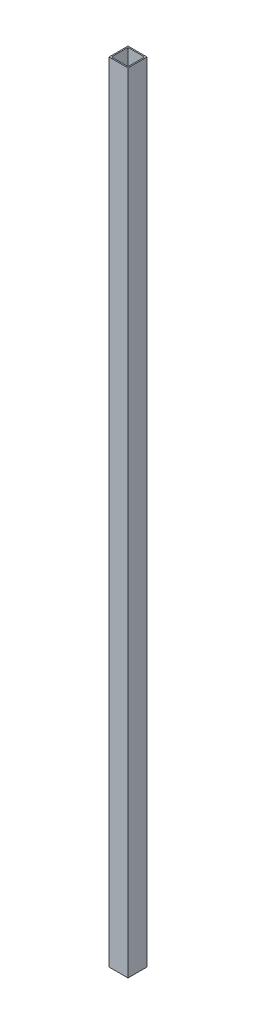
ISO-10303-21;
HEADER;
FILE_DESCRIPTION(('STEP AP214'),'2;1');
FILE_NAME('part.step','',(''),(''),'','','');
FILE_SCHEMA(('AUTOMOTIVE_DESIGN { 1 0 10303 214 1 1 1 1 }'));
ENDSEC;
DATA;
#1=APPLICATION_CONTEXT('core data for automotive mechanical design processes');
#2=APPLICATION_PROTOCOL_DEFINITION('international standard','automotive_design',2000,#1);
#3=PRODUCT_CONTEXT('',#1,'mechanical');
#4=PRODUCT('Part','Part','',(#3));
#5=PRODUCT_RELATED_PRODUCT_CATEGORY('part','',(#4));
#6=PRODUCT_DEFINITION_FORMATION('','',#4);
#7=PRODUCT_DEFINITION_CONTEXT('part definition',#1,'design');
#8=PRODUCT_DEFINITION('design','',#6,#7);
#9=PRODUCT_DEFINITION_SHAPE('','',#8);
#10=(LENGTH_UNIT() NAMED_UNIT(*) SI_UNIT(.MILLI.,.METRE.));
#11=(NAMED_UNIT(*) PLANE_ANGLE_UNIT() SI_UNIT($,.RADIAN.));
#12=(NAMED_UNIT(*) SI_UNIT($,.STERADIAN.) SOLID_ANGLE_UNIT());
#13=UNCERTAINTY_MEASURE_WITH_UNIT(LENGTH_MEASURE(1.E-05),#10,'distance_accuracy_value','');
#14=(GEOMETRIC_REPRESENTATION_CONTEXT(3) GLOBAL_UNCERTAINTY_ASSIGNED_CONTEXT((#13)) GLOBAL_UNIT_ASSIGNED_CONTEXT((#10,
#11,#12)) REPRESENTATION_CONTEXT('',''));
#15=CARTESIAN_POINT('',(0.,0.,0.));
#16=DIRECTION('',(0.,0.,1.));
#17=DIRECTION('',(1.,0.,0.));
#18=AXIS2_PLACEMENT_3D('',#15,#16,#17);
#19=CARTESIAN_POINT('',(-12.7,0.,12.7));
#20=DIRECTION('',(0.,-1.,0.));
#21=DIRECTION('',(0.,0.,-1.));
#22=AXIS2_PLACEMENT_3D('',#19,#20,#21);
#23=PLANE('',#22);
#24=DIRECTION('',(1.,0.,0.));
#25=VECTOR('',#24,1.);
#26=CARTESIAN_POINT('',(0.,0.,-11.1125));
#27=LINE('',#26,#25);
#28=CARTESIAN_POINT('',(-11.1125,0.,-11.1125));
#29=VERTEX_POINT('',#28);
#30=CARTESIAN_POINT('',(11.1125,0.,-11.1125));
#31=VERTEX_POINT('',#30);
#32=EDGE_CURVE('E108',#29,#31,#27,.T.);
#33=ORIENTED_EDGE('',*,*,#32,.F.);
#34=DIRECTION('',(0.,0.,-1.));
#35=VECTOR('',#34,1.);
#36=CARTESIAN_POINT('',(-11.1125,0.,0.));
#37=LINE('',#36,#35);
#38=CARTESIAN_POINT('',(-11.1125,0.,11.1125));
#39=VERTEX_POINT('',#38);
#40=EDGE_CURVE('E110',#39,#29,#37,.T.);
#41=ORIENTED_EDGE('',*,*,#40,.F.);
#42=DIRECTION('',(-1.,0.,0.));
#43=VECTOR('',#42,1.);
#44=CARTESIAN_POINT('',(0.,0.,11.1125));
#45=LINE('',#44,#43);
#46=CARTESIAN_POINT('',(11.1125,0.,11.1125));
#47=VERTEX_POINT('',#46);
#48=EDGE_CURVE('E114',#47,#39,#45,.T.);
#49=ORIENTED_EDGE('',*,*,#48,.F.);
#50=DIRECTION('',(0.,0.,1.));
#51=VECTOR('',#50,1.);
#52=CARTESIAN_POINT('',(11.1125,0.,0.));
#53=LINE('',#52,#51);
#54=EDGE_CURVE('E118',#31,#47,#53,.T.);
#55=ORIENTED_EDGE('',*,*,#54,.F.);
#56=EDGE_LOOP('',(#33,#41,#49,#55));
#57=FACE_BOUND('',#56,.T.);
#58=DIRECTION('',(0.,0.,-1.));
#59=VECTOR('',#58,1.);
#60=CARTESIAN_POINT('',(-12.7,0.,0.));
#61=LINE('',#60,#59);
#62=CARTESIAN_POINT('',(-12.7,0.,12.7));
#63=VERTEX_POINT('',#62);
#64=CARTESIAN_POINT('',(-12.7,0.,-12.7));
#65=VERTEX_POINT('',#64);
#66=EDGE_CURVE('E78',#63,#65,#61,.T.);
#67=ORIENTED_EDGE('',*,*,#66,.T.);
#68=DIRECTION('',(1.,0.,0.));
#69=VECTOR('',#68,1.);
#70=CARTESIAN_POINT('',(0.,0.,-12.7));
#71=LINE('',#70,#69);
#72=CARTESIAN_POINT('',(12.7,0.,-12.7));
#73=VERTEX_POINT('',#72);
#74=EDGE_CURVE('E100',#65,#73,#71,.T.);
#75=ORIENTED_EDGE('',*,*,#74,.T.);
#76=DIRECTION('',(0.,0.,1.));
#77=VECTOR('',#76,1.);
#78=CARTESIAN_POINT('',(12.7,0.,0.));
#79=LINE('',#78,#77);
#80=CARTESIAN_POINT('',(12.7,0.,12.7));
#81=VERTEX_POINT('',#80);
#82=EDGE_CURVE('E82',#73,#81,#79,.T.);
#83=ORIENTED_EDGE('',*,*,#82,.T.);
#84=DIRECTION('',(-1.,0.,0.));
#85=VECTOR('',#84,1.);
#86=CARTESIAN_POINT('',(0.,0.,12.7));
#87=LINE('',#86,#85);
#88=EDGE_CURVE('E20',#81,#63,#87,.T.);
#89=ORIENTED_EDGE('',*,*,#88,.T.);
#90=EDGE_LOOP('',(#67,#75,#83,#89));
#91=FACE_BOUND('',#90,.T.);
#92=ADVANCED_FACE('F16',(#57,#91),#23,.T.);
#93=CARTESIAN_POINT('',(12.7,0.,12.7));
#94=DIRECTION('',(0.,0.,-1.));
#95=DIRECTION('',(-1.,0.,0.));
#96=AXIS2_PLACEMENT_3D('',#93,#94,#95);
#97=PLANE('',#96);
#98=DIRECTION('',(0.,1.,0.));
#99=VECTOR('',#98,1.);
#100=CARTESIAN_POINT('',(12.7,527.05,12.7));
#101=LINE('',#100,#99);
#102=CARTESIAN_POINT('',(12.7,1054.1,12.7));
#103=VERTEX_POINT('',#102);
#104=EDGE_CURVE('E102',#81,#103,#101,.T.);
#105=ORIENTED_EDGE('',*,*,#104,.T.);
#106=DIRECTION('',(-1.,0.,0.));
#107=VECTOR('',#106,1.);
#108=CARTESIAN_POINT('',(0.,1054.1,12.7));
#109=LINE('',#108,#107);
#110=CARTESIAN_POINT('',(-12.7,1054.1,12.7));
#111=VERTEX_POINT('',#110);
#112=EDGE_CURVE('E97',#103,#111,#109,.T.);
#113=ORIENTED_EDGE('',*,*,#112,.T.);
#114=DIRECTION('',(0.,-1.,0.));
#115=VECTOR('',#114,1.);
#116=CARTESIAN_POINT('',(-12.7,527.05,12.7));
#117=LINE('',#116,#115);
#118=EDGE_CURVE('E87',#111,#63,#117,.T.);
#119=ORIENTED_EDGE('',*,*,#118,.T.);
#120=ORIENTED_EDGE('',*,*,#88,.F.);
#121=EDGE_LOOP('',(#105,#113,#119,#120));
#122=FACE_BOUND('',#121,.T.);
#123=ADVANCED_FACE('F96',(#122),#97,.F.);
#124=CARTESIAN_POINT('',(-12.7,0.,12.7));
#125=DIRECTION('',(1.,0.,0.));
#126=DIRECTION('',(0.,0.,-1.));
#127=AXIS2_PLACEMENT_3D('',#124,#125,#126);
#128=PLANE('',#127);
#129=ORIENTED_EDGE('',*,*,#118,.F.);
#130=DIRECTION('',(0.,0.,-1.));
#131=VECTOR('',#130,1.);
#132=CARTESIAN_POINT('',(-12.7,1054.1,0.));
#133=LINE('',#132,#131);
#134=CARTESIAN_POINT('',(-12.7,1054.1,-12.7));
#135=VERTEX_POINT('',#134);
#136=EDGE_CURVE('E125',#111,#135,#133,.T.);
#137=ORIENTED_EDGE('',*,*,#136,.T.);
#138=DIRECTION('',(0.,-1.,0.));
#139=VECTOR('',#138,1.);
#140=CARTESIAN_POINT('',(-12.7,527.05,-12.7));
#141=LINE('',#140,#139);
#142=EDGE_CURVE('E93',#135,#65,#141,.T.);
#143=ORIENTED_EDGE('',*,*,#142,.T.);
#144=ORIENTED_EDGE('',*,*,#66,.F.);
#145=EDGE_LOOP('',(#129,#137,#143,#144));
#146=FACE_BOUND('',#145,.T.);
#147=ADVANCED_FACE('F90',(#146),#128,.F.);
#148=CARTESIAN_POINT('',(-12.7,0.,-12.7));
#149=DIRECTION('',(0.,0.,1.));
#150=DIRECTION('',(1.,0.,0.));
#151=AXIS2_PLACEMENT_3D('',#148,#149,#150);
#152=PLANE('',#151);
#153=ORIENTED_EDGE('',*,*,#142,.F.);
#154=DIRECTION('',(1.,0.,0.));
#155=VECTOR('',#154,1.);
#156=CARTESIAN_POINT('',(0.,1054.1,-12.7));
#157=LINE('',#156,#155);
#158=CARTESIAN_POINT('',(12.7,1054.1,-12.7));
#159=VERTEX_POINT('',#158);
#160=EDGE_CURVE('E127',#135,#159,#157,.T.);
#161=ORIENTED_EDGE('',*,*,#160,.T.);
#162=DIRECTION('',(0.,-1.,0.));
#163=VECTOR('',#162,1.);
#164=CARTESIAN_POINT('',(12.7,527.05,-12.7));
#165=LINE('',#164,#163);
#166=EDGE_CURVE('E104',#159,#73,#165,.T.);
#167=ORIENTED_EDGE('',*,*,#166,.T.);
#168=ORIENTED_EDGE('',*,*,#74,.F.);
#169=EDGE_LOOP('',(#153,#161,#167,#168));
#170=FACE_BOUND('',#169,.T.);
#171=ADVANCED_FACE('F172',(#170),#152,.F.);
#172=CARTESIAN_POINT('',(12.7,0.,-12.7));
#173=DIRECTION('',(-1.,0.,0.));
#174=DIRECTION('',(0.,0.,1.));
#175=AXIS2_PLACEMENT_3D('',#172,#173,#174);
#176=PLANE('',#175);
#177=ORIENTED_EDGE('',*,*,#166,.F.);
#178=DIRECTION('',(0.,0.,1.));
#179=VECTOR('',#178,1.);
#180=CARTESIAN_POINT('',(12.7,1054.1,0.));
#181=LINE('',#180,#179);
#182=EDGE_CURVE('E130',#159,#103,#181,.T.);
#183=ORIENTED_EDGE('',*,*,#182,.T.);
#184=ORIENTED_EDGE('',*,*,#104,.F.);
#185=ORIENTED_EDGE('',*,*,#82,.F.);
#186=EDGE_LOOP('',(#177,#183,#184,#185));
#187=FACE_BOUND('',#186,.T.);
#188=ADVANCED_FACE('F169',(#187),#176,.F.);
#189=CARTESIAN_POINT('',(-11.1125,0.,-11.1125));
#190=DIRECTION('',(0.,0.,1.));
#191=DIRECTION('',(1.,0.,0.));
#192=AXIS2_PLACEMENT_3D('',#189,#190,#191);
#193=PLANE('',#192);
#194=DIRECTION('',(-1.,0.,0.));
#195=VECTOR('',#194,1.);
#196=CARTESIAN_POINT('',(0.,1054.1,-11.1125));
#197=LINE('',#196,#195);
#198=CARTESIAN_POINT('',(11.1125,1054.1,-11.1125));
#199=VERTEX_POINT('',#198);
#200=CARTESIAN_POINT('',(-11.1125,1054.1,-11.1125));
#201=VERTEX_POINT('',#200);
#202=EDGE_CURVE('E133',#199,#201,#197,.T.);
#203=ORIENTED_EDGE('',*,*,#202,.T.);
#204=DIRECTION('',(0.,1.,0.));
#205=VECTOR('',#204,1.);
#206=CARTESIAN_POINT('',(-11.1125,527.05,-11.1125));
#207=LINE('',#206,#205);
#208=EDGE_CURVE('E112',#29,#201,#207,.T.);
#209=ORIENTED_EDGE('',*,*,#208,.F.);
#210=ORIENTED_EDGE('',*,*,#32,.T.);
#211=DIRECTION('',(0.,-1.,0.));
#212=VECTOR('',#211,1.);
#213=CARTESIAN_POINT('',(11.1125,527.05,-11.1125));
#214=LINE('',#213,#212);
#215=EDGE_CURVE('E121',#199,#31,#214,.T.);
#216=ORIENTED_EDGE('',*,*,#215,.F.);
#217=EDGE_LOOP('',(#203,#209,#210,#216));
#218=FACE_BOUND('',#217,.T.);
#219=ADVANCED_FACE('F153',(#218),#193,.T.);
#220=CARTESIAN_POINT('',(-11.1125,0.,11.1125));
#221=DIRECTION('',(1.,0.,0.));
#222=DIRECTION('',(0.,0.,-1.));
#223=AXIS2_PLACEMENT_3D('',#220,#221,#222);
#224=PLANE('',#223);
#225=DIRECTION('',(0.,0.,1.));
#226=VECTOR('',#225,1.);
#227=CARTESIAN_POINT('',(-11.1125,1054.1,0.));
#228=LINE('',#227,#226);
#229=CARTESIAN_POINT('',(-11.1125,1054.1,11.1125));
#230=VERTEX_POINT('',#229);
#231=EDGE_CURVE('E136',#201,#230,#228,.T.);
#232=ORIENTED_EDGE('',*,*,#231,.T.);
#233=DIRECTION('',(0.,1.,0.));
#234=VECTOR('',#233,1.);
#235=CARTESIAN_POINT('',(-11.1125,527.05,11.1125));
#236=LINE('',#235,#234);
#237=EDGE_CURVE('E116',#39,#230,#236,.T.);
#238=ORIENTED_EDGE('',*,*,#237,.F.);
#239=ORIENTED_EDGE('',*,*,#40,.T.);
#240=ORIENTED_EDGE('',*,*,#208,.T.);
#241=EDGE_LOOP('',(#232,#238,#239,#240));
#242=FACE_BOUND('',#241,.T.);
#243=ADVANCED_FACE('F148',(#242),#224,.T.);
#244=CARTESIAN_POINT('',(11.1125,0.,11.1125));
#245=DIRECTION('',(0.,0.,-1.));
#246=DIRECTION('',(-1.,0.,0.));
#247=AXIS2_PLACEMENT_3D('',#244,#245,#246);
#248=PLANE('',#247);
#249=DIRECTION('',(1.,0.,0.));
#250=VECTOR('',#249,1.);
#251=CARTESIAN_POINT('',(0.,1054.1,11.1125));
#252=LINE('',#251,#250);
#253=CARTESIAN_POINT('',(11.1125,1054.1,11.1125));
#254=VERTEX_POINT('',#253);
#255=EDGE_CURVE('E26',#230,#254,#252,.T.);
#256=ORIENTED_EDGE('',*,*,#255,.T.);
#257=DIRECTION('',(0.,1.,0.));
#258=VECTOR('',#257,1.);
#259=CARTESIAN_POINT('',(11.1125,527.05,11.1125));
#260=LINE('',#259,#258);
#261=EDGE_CURVE('E34',#47,#254,#260,.T.);
#262=ORIENTED_EDGE('',*,*,#261,.F.);
#263=ORIENTED_EDGE('',*,*,#48,.T.);
#264=ORIENTED_EDGE('',*,*,#237,.T.);
#265=EDGE_LOOP('',(#256,#262,#263,#264));
#266=FACE_BOUND('',#265,.T.);
#267=ADVANCED_FACE('F142',(#266),#248,.T.);
#268=CARTESIAN_POINT('',(11.1125,0.,-11.1125));
#269=DIRECTION('',(-1.,0.,0.));
#270=DIRECTION('',(0.,0.,1.));
#271=AXIS2_PLACEMENT_3D('',#268,#269,#270);
#272=PLANE('',#271);
#273=DIRECTION('',(0.,0.,-1.));
#274=VECTOR('',#273,1.);
#275=CARTESIAN_POINT('',(11.1125,1054.1,0.));
#276=LINE('',#275,#274);
#277=EDGE_CURVE('E11',#254,#199,#276,.T.);
#278=ORIENTED_EDGE('',*,*,#277,.T.);
#279=ORIENTED_EDGE('',*,*,#215,.T.);
#280=ORIENTED_EDGE('',*,*,#54,.T.);
#281=ORIENTED_EDGE('',*,*,#261,.T.);
#282=EDGE_LOOP('',(#278,#279,#280,#281));
#283=FACE_BOUND('',#282,.T.);
#284=ADVANCED_FACE('F156',(#283),#272,.T.);
#285=CARTESIAN_POINT('',(-12.7,1054.1,12.7));
#286=DIRECTION('',(0.,-1.,0.));
#287=DIRECTION('',(0.,0.,-1.));
#288=AXIS2_PLACEMENT_3D('',#285,#286,#287);
#289=PLANE('',#288);
#290=ORIENTED_EDGE('',*,*,#255,.F.);
#291=ORIENTED_EDGE('',*,*,#231,.F.);
#292=ORIENTED_EDGE('',*,*,#202,.F.);
#293=ORIENTED_EDGE('',*,*,#277,.F.);
#294=EDGE_LOOP('',(#290,#291,#292,#293));
#295=FACE_BOUND('',#294,.T.);
#296=ORIENTED_EDGE('',*,*,#160,.F.);
#297=ORIENTED_EDGE('',*,*,#136,.F.);
#298=ORIENTED_EDGE('',*,*,#112,.F.);
#299=ORIENTED_EDGE('',*,*,#182,.F.);
#300=EDGE_LOOP('',(#296,#297,#298,#299));
#301=FACE_BOUND('',#300,.T.);
#302=ADVANCED_FACE('F18',(#295,#301),#289,.F.);
#303=CLOSED_SHELL('',(#92,#123,#147,#171,#188,#219,#243,#267,#284,#302));
#304=MANIFOLD_SOLID_BREP('B1',#303);
#305=ADVANCED_BREP_SHAPE_REPRESENTATION('',(#18,#304),#14);
#306=SHAPE_DEFINITION_REPRESENTATION(#9,#305);
ENDSEC;
END-ISO-10303-21;
